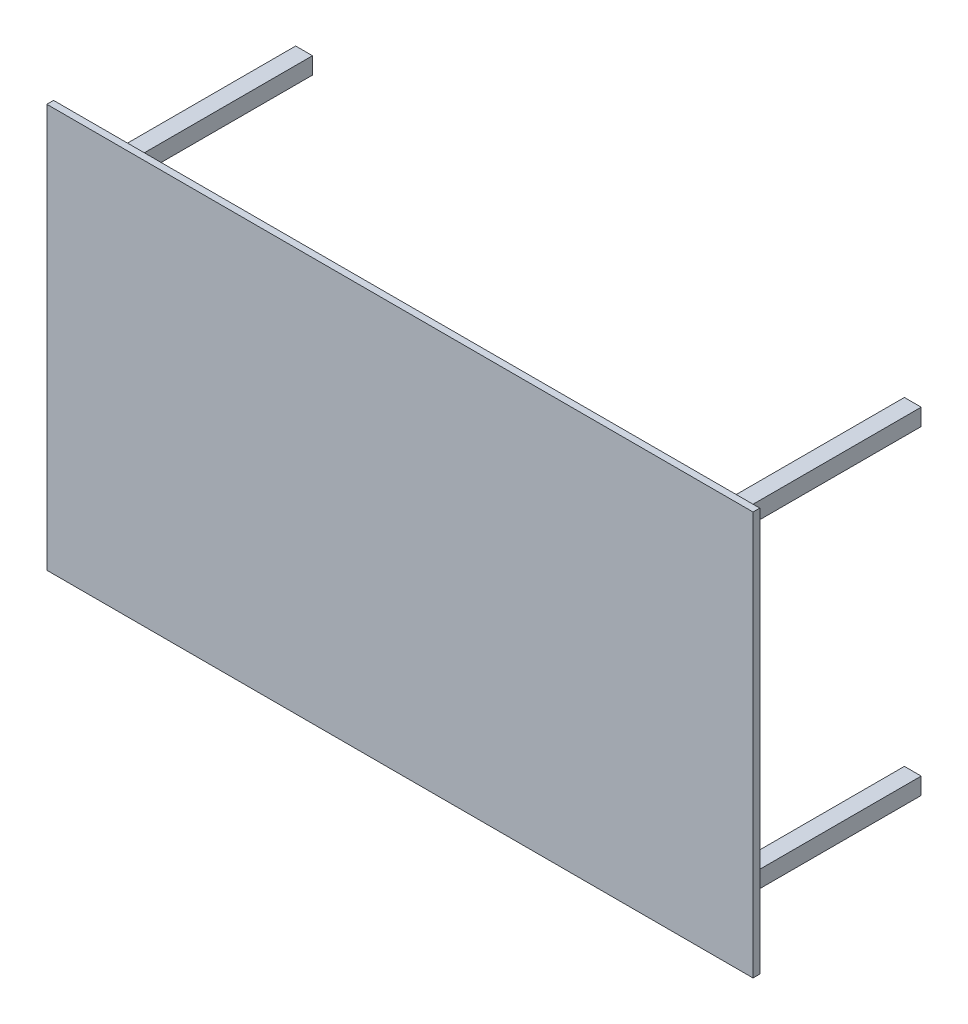
ISO-10303-21;
HEADER;
FILE_DESCRIPTION(('STEP AP214'),'2;1');
FILE_NAME('part.step','',(''),(''),'','','');
FILE_SCHEMA(('AUTOMOTIVE_DESIGN { 1 0 10303 214 1 1 1 1 }'));
ENDSEC;
DATA;
#1=APPLICATION_CONTEXT('core data for automotive mechanical design processes');
#2=APPLICATION_PROTOCOL_DEFINITION('international standard','automotive_design',2000,#1);
#3=PRODUCT_CONTEXT('',#1,'mechanical');
#4=PRODUCT('Part','Part','',(#3));
#5=PRODUCT_RELATED_PRODUCT_CATEGORY('part','',(#4));
#6=PRODUCT_DEFINITION_FORMATION('','',#4);
#7=PRODUCT_DEFINITION_CONTEXT('part definition',#1,'design');
#8=PRODUCT_DEFINITION('design','',#6,#7);
#9=PRODUCT_DEFINITION_SHAPE('','',#8);
#10=(LENGTH_UNIT() NAMED_UNIT(*) SI_UNIT(.MILLI.,.METRE.));
#11=(NAMED_UNIT(*) PLANE_ANGLE_UNIT() SI_UNIT($,.RADIAN.));
#12=(NAMED_UNIT(*) SI_UNIT($,.STERADIAN.) SOLID_ANGLE_UNIT());
#13=UNCERTAINTY_MEASURE_WITH_UNIT(LENGTH_MEASURE(1.E-05),#10,'distance_accuracy_value','');
#14=(GEOMETRIC_REPRESENTATION_CONTEXT(3) GLOBAL_UNCERTAINTY_ASSIGNED_CONTEXT((#13)) GLOBAL_UNIT_ASSIGNED_CONTEXT((#10,
#11,#12)) REPRESENTATION_CONTEXT('',''));
#15=CARTESIAN_POINT('',(0.,0.,0.));
#16=DIRECTION('',(0.,0.,1.));
#17=DIRECTION('',(1.,0.,0.));
#18=AXIS2_PLACEMENT_3D('',#15,#16,#17);
#19=CARTESIAN_POINT('',(0.,0.,0.));
#20=DIRECTION('',(0.,0.,1.));
#21=DIRECTION('',(1.,0.,0.));
#22=AXIS2_PLACEMENT_3D('',#19,#20,#21);
#23=PLANE('',#22);
#24=DIRECTION('',(0.,1.,0.));
#25=VECTOR('',#24,1.);
#26=CARTESIAN_POINT('',(880.,-450.,0.));
#27=LINE('',#26,#25);
#28=CARTESIAN_POINT('',(880.,-500.,0.));
#29=VERTEX_POINT('',#28);
#30=CARTESIAN_POINT('',(880.,-450.,0.));
#31=VERTEX_POINT('',#30);
#32=EDGE_CURVE('E193',#29,#31,#27,.T.);
#33=ORIENTED_EDGE('',*,*,#32,.F.);
#34=DIRECTION('',(-1.,0.,0.));
#35=VECTOR('',#34,1.);
#36=CARTESIAN_POINT('',(930.,-500.,0.));
#37=LINE('',#36,#35);
#38=CARTESIAN_POINT('',(930.,-500.,0.));
#39=VERTEX_POINT('',#38);
#40=EDGE_CURVE('E206',#39,#29,#37,.T.);
#41=ORIENTED_EDGE('',*,*,#40,.F.);
#42=DIRECTION('',(0.,-1.,0.));
#43=VECTOR('',#42,1.);
#44=CARTESIAN_POINT('',(930.,-450.,0.));
#45=LINE('',#44,#43);
#46=CARTESIAN_POINT('',(930.,-450.,0.));
#47=VERTEX_POINT('',#46);
#48=EDGE_CURVE('E215',#47,#39,#45,.T.);
#49=ORIENTED_EDGE('',*,*,#48,.F.);
#50=DIRECTION('',(1.,0.,0.));
#51=VECTOR('',#50,1.);
#52=CARTESIAN_POINT('',(930.,-450.,0.));
#53=LINE('',#52,#51);
#54=EDGE_CURVE('E196',#31,#47,#53,.T.);
#55=ORIENTED_EDGE('',*,*,#54,.F.);
#56=EDGE_LOOP('',(#33,#41,#49,#55));
#57=FACE_BOUND('',#56,.T.);
#58=DIRECTION('',(0.,1.,0.));
#59=VECTOR('',#58,1.);
#60=CARTESIAN_POINT('',(880.,500.,0.));
#61=LINE('',#60,#59);
#62=CARTESIAN_POINT('',(880.,450.,0.));
#63=VERTEX_POINT('',#62);
#64=CARTESIAN_POINT('',(880.,500.,0.));
#65=VERTEX_POINT('',#64);
#66=EDGE_CURVE('E264',#63,#65,#61,.T.);
#67=ORIENTED_EDGE('',*,*,#66,.F.);
#68=DIRECTION('',(-1.,0.,0.));
#69=VECTOR('',#68,1.);
#70=CARTESIAN_POINT('',(930.,450.,0.));
#71=LINE('',#70,#69);
#72=CARTESIAN_POINT('',(930.,450.,0.));
#73=VERTEX_POINT('',#72);
#74=EDGE_CURVE('E269',#73,#63,#71,.T.);
#75=ORIENTED_EDGE('',*,*,#74,.F.);
#76=DIRECTION('',(0.,-1.,0.));
#77=VECTOR('',#76,1.);
#78=CARTESIAN_POINT('',(930.,500.,0.));
#79=LINE('',#78,#77);
#80=CARTESIAN_POINT('',(930.,500.,0.));
#81=VERTEX_POINT('',#80);
#82=EDGE_CURVE('E281',#81,#73,#79,.T.);
#83=ORIENTED_EDGE('',*,*,#82,.F.);
#84=DIRECTION('',(1.,0.,0.));
#85=VECTOR('',#84,1.);
#86=CARTESIAN_POINT('',(930.,500.,0.));
#87=LINE('',#86,#85);
#88=EDGE_CURVE('E278',#65,#81,#87,.T.);
#89=ORIENTED_EDGE('',*,*,#88,.F.);
#90=EDGE_LOOP('',(#67,#75,#83,#89));
#91=FACE_BOUND('',#90,.T.);
#92=DIRECTION('',(0.,1.,0.));
#93=VECTOR('',#92,1.);
#94=CARTESIAN_POINT('',(1050.,600.,0.));
#95=LINE('',#94,#93);
#96=CARTESIAN_POINT('',(1050.,-600.,0.));
#97=VERTEX_POINT('',#96);
#98=CARTESIAN_POINT('',(1050.,600.,0.));
#99=VERTEX_POINT('',#98);
#100=EDGE_CURVE('E297',#97,#99,#95,.T.);
#101=ORIENTED_EDGE('',*,*,#100,.F.);
#102=DIRECTION('',(1.,0.,0.));
#103=VECTOR('',#102,1.);
#104=CARTESIAN_POINT('',(-1050.,-600.,0.));
#105=LINE('',#104,#103);
#106=CARTESIAN_POINT('',(-1050.,-600.,0.));
#107=VERTEX_POINT('',#106);
#108=EDGE_CURVE('E302',#107,#97,#105,.T.);
#109=ORIENTED_EDGE('',*,*,#108,.F.);
#110=DIRECTION('',(0.,-1.,0.));
#111=VECTOR('',#110,1.);
#112=CARTESIAN_POINT('',(-1050.,600.,0.));
#113=LINE('',#112,#111);
#114=CARTESIAN_POINT('',(-1050.,600.,0.));
#115=VERTEX_POINT('',#114);
#116=EDGE_CURVE('E313',#115,#107,#113,.T.);
#117=ORIENTED_EDGE('',*,*,#116,.F.);
#118=DIRECTION('',(-1.,0.,0.));
#119=VECTOR('',#118,1.);
#120=CARTESIAN_POINT('',(-1050.,600.,0.));
#121=LINE('',#120,#119);
#122=EDGE_CURVE('E311',#99,#115,#121,.T.);
#123=ORIENTED_EDGE('',*,*,#122,.F.);
#124=EDGE_LOOP('',(#101,#109,#117,#123));
#125=FACE_BOUND('',#124,.T.);
#126=DIRECTION('',(0.,1.,0.));
#127=VECTOR('',#126,1.);
#128=CARTESIAN_POINT('',(-930.,-450.,0.));
#129=LINE('',#128,#127);
#130=CARTESIAN_POINT('',(-930.,-500.,0.));
#131=VERTEX_POINT('',#130);
#132=CARTESIAN_POINT('',(-930.,-450.,0.));
#133=VERTEX_POINT('',#132);
#134=EDGE_CURVE('E231',#131,#133,#129,.T.);
#135=ORIENTED_EDGE('',*,*,#134,.F.);
#136=DIRECTION('',(-1.,0.,0.));
#137=VECTOR('',#136,1.);
#138=CARTESIAN_POINT('',(-930.,-500.,0.));
#139=LINE('',#138,#137);
#140=CARTESIAN_POINT('',(-880.,-500.,0.));
#141=VERTEX_POINT('',#140);
#142=EDGE_CURVE('E236',#141,#131,#139,.T.);
#143=ORIENTED_EDGE('',*,*,#142,.F.);
#144=DIRECTION('',(0.,-1.,0.));
#145=VECTOR('',#144,1.);
#146=CARTESIAN_POINT('',(-880.,-450.,0.));
#147=LINE('',#146,#145);
#148=CARTESIAN_POINT('',(-880.,-450.,0.));
#149=VERTEX_POINT('',#148);
#150=EDGE_CURVE('E248',#149,#141,#147,.T.);
#151=ORIENTED_EDGE('',*,*,#150,.F.);
#152=DIRECTION('',(1.,0.,0.));
#153=VECTOR('',#152,1.);
#154=CARTESIAN_POINT('',(-930.,-450.,0.));
#155=LINE('',#154,#153);
#156=EDGE_CURVE('E245',#133,#149,#155,.T.);
#157=ORIENTED_EDGE('',*,*,#156,.F.);
#158=EDGE_LOOP('',(#135,#143,#151,#157));
#159=FACE_BOUND('',#158,.T.);
#160=DIRECTION('',(0.,1.,0.));
#161=VECTOR('',#160,1.);
#162=CARTESIAN_POINT('',(-930.,500.,0.));
#163=LINE('',#162,#161);
#164=CARTESIAN_POINT('',(-930.,450.,0.));
#165=VERTEX_POINT('',#164);
#166=CARTESIAN_POINT('',(-930.,500.,0.));
#167=VERTEX_POINT('',#166);
#168=EDGE_CURVE('E192',#165,#167,#163,.T.);
#169=ORIENTED_EDGE('',*,*,#168,.F.);
#170=DIRECTION('',(-1.,0.,0.));
#171=VECTOR('',#170,1.);
#172=CARTESIAN_POINT('',(-930.,450.,0.));
#173=LINE('',#172,#171);
#174=CARTESIAN_POINT('',(-880.,450.,0.));
#175=VERTEX_POINT('',#174);
#176=EDGE_CURVE('E189',#175,#165,#173,.T.);
#177=ORIENTED_EDGE('',*,*,#176,.F.);
#178=DIRECTION('',(0.,-1.,0.));
#179=VECTOR('',#178,1.);
#180=CARTESIAN_POINT('',(-880.,500.,0.));
#181=LINE('',#180,#179);
#182=CARTESIAN_POINT('',(-880.,500.,0.));
#183=VERTEX_POINT('',#182);
#184=EDGE_CURVE('E55',#183,#175,#181,.T.);
#185=ORIENTED_EDGE('',*,*,#184,.F.);
#186=DIRECTION('',(1.,0.,0.));
#187=VECTOR('',#186,1.);
#188=CARTESIAN_POINT('',(-930.,500.,0.));
#189=LINE('',#188,#187);
#190=EDGE_CURVE('E50',#167,#183,#189,.T.);
#191=ORIENTED_EDGE('',*,*,#190,.F.);
#192=EDGE_LOOP('',(#169,#177,#185,#191));
#193=FACE_BOUND('',#192,.T.);
#194=ADVANCED_FACE('F35',(#57,#91,#125,#159,#193),#23,.F.);
#195=CARTESIAN_POINT('',(1050.,600.,20.));
#196=DIRECTION('',(-1.,0.,0.));
#197=DIRECTION('',(0.,-1.,0.));
#198=AXIS2_PLACEMENT_3D('',#195,#196,#197);
#199=PLANE('',#198);
#200=ORIENTED_EDGE('',*,*,#100,.T.);
#201=DIRECTION('',(0.,0.,-1.));
#202=VECTOR('',#201,1.);
#203=CARTESIAN_POINT('',(1050.,600.,20.));
#204=LINE('',#203,#202);
#205=CARTESIAN_POINT('',(1050.,600.,20.));
#206=VERTEX_POINT('',#205);
#207=EDGE_CURVE('E11',#206,#99,#204,.T.);
#208=ORIENTED_EDGE('',*,*,#207,.F.);
#209=DIRECTION('',(0.,1.,0.));
#210=VECTOR('',#209,1.);
#211=CARTESIAN_POINT('',(1050.,600.,20.));
#212=LINE('',#211,#210);
#213=CARTESIAN_POINT('',(1050.,-600.,20.));
#214=VERTEX_POINT('',#213);
#215=EDGE_CURVE('E298',#214,#206,#212,.T.);
#216=ORIENTED_EDGE('',*,*,#215,.F.);
#217=DIRECTION('',(0.,0.,-1.));
#218=VECTOR('',#217,1.);
#219=CARTESIAN_POINT('',(1050.,-600.,20.));
#220=LINE('',#219,#218);
#221=EDGE_CURVE('E308',#214,#97,#220,.T.);
#222=ORIENTED_EDGE('',*,*,#221,.T.);
#223=EDGE_LOOP('',(#200,#208,#216,#222));
#224=FACE_BOUND('',#223,.T.);
#225=ADVANCED_FACE('F37',(#224),#199,.F.);
#226=CARTESIAN_POINT('',(-1050.,600.,20.));
#227=DIRECTION('',(0.,-1.,0.));
#228=DIRECTION('',(0.,0.,-1.));
#229=AXIS2_PLACEMENT_3D('',#226,#227,#228);
#230=PLANE('',#229);
#231=ORIENTED_EDGE('',*,*,#122,.T.);
#232=DIRECTION('',(0.,0.,-1.));
#233=VECTOR('',#232,1.);
#234=CARTESIAN_POINT('',(-1050.,600.,20.));
#235=LINE('',#234,#233);
#236=CARTESIAN_POINT('',(-1050.,600.,20.));
#237=VERTEX_POINT('',#236);
#238=EDGE_CURVE('E43',#237,#115,#235,.T.);
#239=ORIENTED_EDGE('',*,*,#238,.F.);
#240=DIRECTION('',(-1.,0.,0.));
#241=VECTOR('',#240,1.);
#242=CARTESIAN_POINT('',(-1050.,600.,20.));
#243=LINE('',#242,#241);
#244=EDGE_CURVE('E301',#206,#237,#243,.T.);
#245=ORIENTED_EDGE('',*,*,#244,.F.);
#246=ORIENTED_EDGE('',*,*,#207,.T.);
#247=EDGE_LOOP('',(#231,#239,#245,#246));
#248=FACE_BOUND('',#247,.T.);
#249=ADVANCED_FACE('F341',(#248),#230,.F.);
#250=CARTESIAN_POINT('',(-1050.,600.,20.));
#251=DIRECTION('',(1.,0.,0.));
#252=DIRECTION('',(0.,0.,-1.));
#253=AXIS2_PLACEMENT_3D('',#250,#251,#252);
#254=PLANE('',#253);
#255=ORIENTED_EDGE('',*,*,#116,.T.);
#256=DIRECTION('',(0.,0.,-1.));
#257=VECTOR('',#256,1.);
#258=CARTESIAN_POINT('',(-1050.,-600.,20.));
#259=LINE('',#258,#257);
#260=CARTESIAN_POINT('',(-1050.,-600.,20.));
#261=VERTEX_POINT('',#260);
#262=EDGE_CURVE('E318',#261,#107,#259,.T.);
#263=ORIENTED_EDGE('',*,*,#262,.F.);
#264=DIRECTION('',(0.,-1.,0.));
#265=VECTOR('',#264,1.);
#266=CARTESIAN_POINT('',(-1050.,600.,20.));
#267=LINE('',#266,#265);
#268=EDGE_CURVE('E304',#237,#261,#267,.T.);
#269=ORIENTED_EDGE('',*,*,#268,.F.);
#270=ORIENTED_EDGE('',*,*,#238,.T.);
#271=EDGE_LOOP('',(#255,#263,#269,#270));
#272=FACE_BOUND('',#271,.T.);
#273=ADVANCED_FACE('F325',(#272),#254,.F.);
#274=CARTESIAN_POINT('',(-1050.,-600.,20.));
#275=DIRECTION('',(0.,1.,0.));
#276=DIRECTION('',(0.,0.,1.));
#277=AXIS2_PLACEMENT_3D('',#274,#275,#276);
#278=PLANE('',#277);
#279=ORIENTED_EDGE('',*,*,#108,.T.);
#280=ORIENTED_EDGE('',*,*,#221,.F.);
#281=DIRECTION('',(1.,0.,0.));
#282=VECTOR('',#281,1.);
#283=CARTESIAN_POINT('',(-1050.,-600.,20.));
#284=LINE('',#283,#282);
#285=EDGE_CURVE('E306',#261,#214,#284,.T.);
#286=ORIENTED_EDGE('',*,*,#285,.F.);
#287=ORIENTED_EDGE('',*,*,#262,.T.);
#288=EDGE_LOOP('',(#279,#280,#286,#287));
#289=FACE_BOUND('',#288,.T.);
#290=ADVANCED_FACE('F334',(#289),#278,.F.);
#291=CARTESIAN_POINT('',(0.,0.,20.));
#292=DIRECTION('',(0.,0.,1.));
#293=DIRECTION('',(1.,0.,0.));
#294=AXIS2_PLACEMENT_3D('',#291,#292,#293);
#295=PLANE('',#294);
#296=ORIENTED_EDGE('',*,*,#215,.T.);
#297=ORIENTED_EDGE('',*,*,#244,.T.);
#298=ORIENTED_EDGE('',*,*,#268,.T.);
#299=ORIENTED_EDGE('',*,*,#285,.T.);
#300=EDGE_LOOP('',(#296,#297,#298,#299));
#301=FACE_BOUND('',#300,.T.);
#302=ADVANCED_FACE('F340',(#301),#295,.T.);
#303=CARTESIAN_POINT('',(880.,500.,-600.));
#304=DIRECTION('',(1.,0.,0.));
#305=DIRECTION('',(0.,0.,-1.));
#306=AXIS2_PLACEMENT_3D('',#303,#304,#305);
#307=PLANE('',#306);
#308=ORIENTED_EDGE('',*,*,#66,.T.);
#309=DIRECTION('',(0.,0.,1.));
#310=VECTOR('',#309,1.);
#311=CARTESIAN_POINT('',(880.,500.,-600.));
#312=LINE('',#311,#310);
#313=CARTESIAN_POINT('',(880.,500.,-600.));
#314=VERTEX_POINT('',#313);
#315=EDGE_CURVE('E294',#314,#65,#312,.T.);
#316=ORIENTED_EDGE('',*,*,#315,.F.);
#317=DIRECTION('',(0.,1.,0.));
#318=VECTOR('',#317,1.);
#319=CARTESIAN_POINT('',(880.,500.,-600.));
#320=LINE('',#319,#318);
#321=CARTESIAN_POINT('',(880.,450.,-600.));
#322=VERTEX_POINT('',#321);
#323=EDGE_CURVE('E265',#322,#314,#320,.T.);
#324=ORIENTED_EDGE('',*,*,#323,.F.);
#325=DIRECTION('',(0.,0.,1.));
#326=VECTOR('',#325,1.);
#327=CARTESIAN_POINT('',(880.,450.,-600.));
#328=LINE('',#327,#326);
#329=EDGE_CURVE('E275',#322,#63,#328,.T.);
#330=ORIENTED_EDGE('',*,*,#329,.T.);
#331=EDGE_LOOP('',(#308,#316,#324,#330));
#332=FACE_BOUND('',#331,.T.);
#333=ADVANCED_FACE('F361',(#332),#307,.F.);
#334=CARTESIAN_POINT('',(930.,500.,-600.));
#335=DIRECTION('',(0.,-1.,0.));
#336=DIRECTION('',(0.,0.,-1.));
#337=AXIS2_PLACEMENT_3D('',#334,#335,#336);
#338=PLANE('',#337);
#339=ORIENTED_EDGE('',*,*,#88,.T.);
#340=DIRECTION('',(0.,0.,1.));
#341=VECTOR('',#340,1.);
#342=CARTESIAN_POINT('',(930.,500.,-600.));
#343=LINE('',#342,#341);
#344=CARTESIAN_POINT('',(930.,500.,-600.));
#345=VERTEX_POINT('',#344);
#346=EDGE_CURVE('E291',#345,#81,#343,.T.);
#347=ORIENTED_EDGE('',*,*,#346,.F.);
#348=DIRECTION('',(1.,0.,0.));
#349=VECTOR('',#348,1.);
#350=CARTESIAN_POINT('',(930.,500.,-600.));
#351=LINE('',#350,#349);
#352=EDGE_CURVE('E268',#314,#345,#351,.T.);
#353=ORIENTED_EDGE('',*,*,#352,.F.);
#354=ORIENTED_EDGE('',*,*,#315,.T.);
#355=EDGE_LOOP('',(#339,#347,#353,#354));
#356=FACE_BOUND('',#355,.T.);
#357=ADVANCED_FACE('F365',(#356),#338,.F.);
#358=CARTESIAN_POINT('',(930.,500.,-600.));
#359=DIRECTION('',(-1.,0.,0.));
#360=DIRECTION('',(0.,0.,1.));
#361=AXIS2_PLACEMENT_3D('',#358,#359,#360);
#362=PLANE('',#361);
#363=ORIENTED_EDGE('',*,*,#82,.T.);
#364=DIRECTION('',(0.,0.,1.));
#365=VECTOR('',#364,1.);
#366=CARTESIAN_POINT('',(930.,450.,-600.));
#367=LINE('',#366,#365);
#368=CARTESIAN_POINT('',(930.,450.,-600.));
#369=VERTEX_POINT('',#368);
#370=EDGE_CURVE('E288',#369,#73,#367,.T.);
#371=ORIENTED_EDGE('',*,*,#370,.F.);
#372=DIRECTION('',(0.,-1.,0.));
#373=VECTOR('',#372,1.);
#374=CARTESIAN_POINT('',(930.,500.,-600.));
#375=LINE('',#374,#373);
#376=EDGE_CURVE('E271',#345,#369,#375,.T.);
#377=ORIENTED_EDGE('',*,*,#376,.F.);
#378=ORIENTED_EDGE('',*,*,#346,.T.);
#379=EDGE_LOOP('',(#363,#371,#377,#378));
#380=FACE_BOUND('',#379,.T.);
#381=ADVANCED_FACE('F370',(#380),#362,.F.);
#382=CARTESIAN_POINT('',(930.,450.,-600.));
#383=DIRECTION('',(0.,1.,0.));
#384=DIRECTION('',(0.,0.,1.));
#385=AXIS2_PLACEMENT_3D('',#382,#383,#384);
#386=PLANE('',#385);
#387=ORIENTED_EDGE('',*,*,#74,.T.);
#388=ORIENTED_EDGE('',*,*,#329,.F.);
#389=DIRECTION('',(-1.,0.,0.));
#390=VECTOR('',#389,1.);
#391=CARTESIAN_POINT('',(930.,450.,-600.));
#392=LINE('',#391,#390);
#393=EDGE_CURVE('E273',#369,#322,#392,.T.);
#394=ORIENTED_EDGE('',*,*,#393,.F.);
#395=ORIENTED_EDGE('',*,*,#370,.T.);
#396=EDGE_LOOP('',(#387,#388,#394,#395));
#397=FACE_BOUND('',#396,.T.);
#398=ADVANCED_FACE('F376',(#397),#386,.F.);
#399=CARTESIAN_POINT('',(0.,0.,-600.));
#400=DIRECTION('',(0.,0.,-1.));
#401=DIRECTION('',(-1.,0.,0.));
#402=AXIS2_PLACEMENT_3D('',#399,#400,#401);
#403=PLANE('',#402);
#404=ORIENTED_EDGE('',*,*,#323,.T.);
#405=ORIENTED_EDGE('',*,*,#352,.T.);
#406=ORIENTED_EDGE('',*,*,#376,.T.);
#407=ORIENTED_EDGE('',*,*,#393,.T.);
#408=EDGE_LOOP('',(#404,#405,#406,#407));
#409=FACE_BOUND('',#408,.T.);
#410=ADVANCED_FACE('F380',(#409),#403,.T.);
#411=CARTESIAN_POINT('',(-930.,-450.,-600.));
#412=DIRECTION('',(1.,0.,0.));
#413=DIRECTION('',(0.,0.,-1.));
#414=AXIS2_PLACEMENT_3D('',#411,#412,#413);
#415=PLANE('',#414);
#416=ORIENTED_EDGE('',*,*,#134,.T.);
#417=DIRECTION('',(0.,0.,1.));
#418=VECTOR('',#417,1.);
#419=CARTESIAN_POINT('',(-930.,-450.,-600.));
#420=LINE('',#419,#418);
#421=CARTESIAN_POINT('',(-930.,-450.,-600.));
#422=VERTEX_POINT('',#421);
#423=EDGE_CURVE('E261',#422,#133,#420,.T.);
#424=ORIENTED_EDGE('',*,*,#423,.F.);
#425=DIRECTION('',(0.,1.,0.));
#426=VECTOR('',#425,1.);
#427=CARTESIAN_POINT('',(-930.,-450.,-600.));
#428=LINE('',#427,#426);
#429=CARTESIAN_POINT('',(-930.,-500.,-600.));
#430=VERTEX_POINT('',#429);
#431=EDGE_CURVE('E232',#430,#422,#428,.T.);
#432=ORIENTED_EDGE('',*,*,#431,.F.);
#433=DIRECTION('',(0.,0.,1.));
#434=VECTOR('',#433,1.);
#435=CARTESIAN_POINT('',(-930.,-500.,-600.));
#436=LINE('',#435,#434);
#437=EDGE_CURVE('E242',#430,#131,#436,.T.);
#438=ORIENTED_EDGE('',*,*,#437,.T.);
#439=EDGE_LOOP('',(#416,#424,#432,#438));
#440=FACE_BOUND('',#439,.T.);
#441=ADVANCED_FACE('F384',(#440),#415,.F.);
#442=CARTESIAN_POINT('',(-930.,-450.,-600.));
#443=DIRECTION('',(0.,-1.,0.));
#444=DIRECTION('',(0.,0.,-1.));
#445=AXIS2_PLACEMENT_3D('',#442,#443,#444);
#446=PLANE('',#445);
#447=ORIENTED_EDGE('',*,*,#156,.T.);
#448=DIRECTION('',(0.,0.,1.));
#449=VECTOR('',#448,1.);
#450=CARTESIAN_POINT('',(-880.,-450.,-600.));
#451=LINE('',#450,#449);
#452=CARTESIAN_POINT('',(-880.,-450.,-600.));
#453=VERTEX_POINT('',#452);
#454=EDGE_CURVE('E258',#453,#149,#451,.T.);
#455=ORIENTED_EDGE('',*,*,#454,.F.);
#456=DIRECTION('',(1.,0.,0.));
#457=VECTOR('',#456,1.);
#458=CARTESIAN_POINT('',(-930.,-450.,-600.));
#459=LINE('',#458,#457);
#460=EDGE_CURVE('E235',#422,#453,#459,.T.);
#461=ORIENTED_EDGE('',*,*,#460,.F.);
#462=ORIENTED_EDGE('',*,*,#423,.T.);
#463=EDGE_LOOP('',(#447,#455,#461,#462));
#464=FACE_BOUND('',#463,.T.);
#465=ADVANCED_FACE('F388',(#464),#446,.F.);
#466=CARTESIAN_POINT('',(-880.,-450.,-600.));
#467=DIRECTION('',(-1.,0.,0.));
#468=DIRECTION('',(0.,0.,1.));
#469=AXIS2_PLACEMENT_3D('',#466,#467,#468);
#470=PLANE('',#469);
#471=ORIENTED_EDGE('',*,*,#150,.T.);
#472=DIRECTION('',(0.,0.,1.));
#473=VECTOR('',#472,1.);
#474=CARTESIAN_POINT('',(-880.,-500.,-600.));
#475=LINE('',#474,#473);
#476=CARTESIAN_POINT('',(-880.,-500.,-600.));
#477=VERTEX_POINT('',#476);
#478=EDGE_CURVE('E255',#477,#141,#475,.T.);
#479=ORIENTED_EDGE('',*,*,#478,.F.);
#480=DIRECTION('',(0.,-1.,0.));
#481=VECTOR('',#480,1.);
#482=CARTESIAN_POINT('',(-880.,-450.,-600.));
#483=LINE('',#482,#481);
#484=EDGE_CURVE('E238',#453,#477,#483,.T.);
#485=ORIENTED_EDGE('',*,*,#484,.F.);
#486=ORIENTED_EDGE('',*,*,#454,.T.);
#487=EDGE_LOOP('',(#471,#479,#485,#486));
#488=FACE_BOUND('',#487,.T.);
#489=ADVANCED_FACE('F392',(#488),#470,.F.);
#490=CARTESIAN_POINT('',(-930.,-500.,-600.));
#491=DIRECTION('',(0.,1.,0.));
#492=DIRECTION('',(0.,0.,1.));
#493=AXIS2_PLACEMENT_3D('',#490,#491,#492);
#494=PLANE('',#493);
#495=ORIENTED_EDGE('',*,*,#142,.T.);
#496=ORIENTED_EDGE('',*,*,#437,.F.);
#497=DIRECTION('',(-1.,0.,0.));
#498=VECTOR('',#497,1.);
#499=CARTESIAN_POINT('',(-930.,-500.,-600.));
#500=LINE('',#499,#498);
#501=EDGE_CURVE('E240',#477,#430,#500,.T.);
#502=ORIENTED_EDGE('',*,*,#501,.F.);
#503=ORIENTED_EDGE('',*,*,#478,.T.);
#504=EDGE_LOOP('',(#495,#496,#502,#503));
#505=FACE_BOUND('',#504,.T.);
#506=ADVANCED_FACE('F396',(#505),#494,.F.);
#507=CARTESIAN_POINT('',(0.,0.,-600.));
#508=DIRECTION('',(0.,0.,1.));
#509=DIRECTION('',(1.,0.,0.));
#510=AXIS2_PLACEMENT_3D('',#507,#508,#509);
#511=PLANE('',#510);
#512=ORIENTED_EDGE('',*,*,#431,.T.);
#513=ORIENTED_EDGE('',*,*,#460,.T.);
#514=ORIENTED_EDGE('',*,*,#484,.T.);
#515=ORIENTED_EDGE('',*,*,#501,.T.);
#516=EDGE_LOOP('',(#512,#513,#514,#515));
#517=FACE_BOUND('',#516,.T.);
#518=ADVANCED_FACE('F400',(#517),#511,.F.);
#519=CARTESIAN_POINT('',(880.,-450.,-600.));
#520=DIRECTION('',(1.,0.,0.));
#521=DIRECTION('',(0.,0.,-1.));
#522=AXIS2_PLACEMENT_3D('',#519,#520,#521);
#523=PLANE('',#522);
#524=ORIENTED_EDGE('',*,*,#32,.T.);
#525=DIRECTION('',(0.,0.,1.));
#526=VECTOR('',#525,1.);
#527=CARTESIAN_POINT('',(880.,-450.,-600.));
#528=LINE('',#527,#526);
#529=CARTESIAN_POINT('',(880.,-450.,-600.));
#530=VERTEX_POINT('',#529);
#531=EDGE_CURVE('E228',#530,#31,#528,.T.);
#532=ORIENTED_EDGE('',*,*,#531,.F.);
#533=DIRECTION('',(0.,1.,0.));
#534=VECTOR('',#533,1.);
#535=CARTESIAN_POINT('',(880.,-450.,-600.));
#536=LINE('',#535,#534);
#537=CARTESIAN_POINT('',(880.,-500.,-600.));
#538=VERTEX_POINT('',#537);
#539=EDGE_CURVE('E202',#538,#530,#536,.T.);
#540=ORIENTED_EDGE('',*,*,#539,.F.);
#541=DIRECTION('',(0.,0.,1.));
#542=VECTOR('',#541,1.);
#543=CARTESIAN_POINT('',(880.,-500.,-600.));
#544=LINE('',#543,#542);
#545=EDGE_CURVE('E211',#538,#29,#544,.T.);
#546=ORIENTED_EDGE('',*,*,#545,.T.);
#547=EDGE_LOOP('',(#524,#532,#540,#546));
#548=FACE_BOUND('',#547,.T.);
#549=ADVANCED_FACE('F404',(#548),#523,.F.);
#550=CARTESIAN_POINT('',(930.,-450.,-600.));
#551=DIRECTION('',(0.,-1.,0.));
#552=DIRECTION('',(0.,0.,-1.));
#553=AXIS2_PLACEMENT_3D('',#550,#551,#552);
#554=PLANE('',#553);
#555=ORIENTED_EDGE('',*,*,#54,.T.);
#556=DIRECTION('',(0.,0.,1.));
#557=VECTOR('',#556,1.);
#558=CARTESIAN_POINT('',(930.,-450.,-600.));
#559=LINE('',#558,#557);
#560=CARTESIAN_POINT('',(930.,-450.,-600.));
#561=VERTEX_POINT('',#560);
#562=EDGE_CURVE('E225',#561,#47,#559,.T.);
#563=ORIENTED_EDGE('',*,*,#562,.F.);
#564=DIRECTION('',(1.,0.,0.));
#565=VECTOR('',#564,1.);
#566=CARTESIAN_POINT('',(930.,-450.,-600.));
#567=LINE('',#566,#565);
#568=EDGE_CURVE('E205',#530,#561,#567,.T.);
#569=ORIENTED_EDGE('',*,*,#568,.F.);
#570=ORIENTED_EDGE('',*,*,#531,.T.);
#571=EDGE_LOOP('',(#555,#563,#569,#570));
#572=FACE_BOUND('',#571,.T.);
#573=ADVANCED_FACE('F408',(#572),#554,.F.);
#574=CARTESIAN_POINT('',(930.,-450.,-600.));
#575=DIRECTION('',(-1.,0.,0.));
#576=DIRECTION('',(0.,0.,1.));
#577=AXIS2_PLACEMENT_3D('',#574,#575,#576);
#578=PLANE('',#577);
#579=ORIENTED_EDGE('',*,*,#48,.T.);
#580=DIRECTION('',(0.,0.,1.));
#581=VECTOR('',#580,1.);
#582=CARTESIAN_POINT('',(930.,-500.,-600.));
#583=LINE('',#582,#581);
#584=CARTESIAN_POINT('',(930.,-500.,-600.));
#585=VERTEX_POINT('',#584);
#586=EDGE_CURVE('E222',#585,#39,#583,.T.);
#587=ORIENTED_EDGE('',*,*,#586,.F.);
#588=DIRECTION('',(0.,-1.,0.));
#589=VECTOR('',#588,1.);
#590=CARTESIAN_POINT('',(930.,-450.,-600.));
#591=LINE('',#590,#589);
#592=EDGE_CURVE('E208',#561,#585,#591,.T.);
#593=ORIENTED_EDGE('',*,*,#592,.F.);
#594=ORIENTED_EDGE('',*,*,#562,.T.);
#595=EDGE_LOOP('',(#579,#587,#593,#594));
#596=FACE_BOUND('',#595,.T.);
#597=ADVANCED_FACE('F412',(#596),#578,.F.);
#598=CARTESIAN_POINT('',(930.,-500.,-600.));
#599=DIRECTION('',(0.,1.,0.));
#600=DIRECTION('',(0.,0.,1.));
#601=AXIS2_PLACEMENT_3D('',#598,#599,#600);
#602=PLANE('',#601);
#603=ORIENTED_EDGE('',*,*,#40,.T.);
#604=ORIENTED_EDGE('',*,*,#545,.F.);
#605=DIRECTION('',(-1.,0.,0.));
#606=VECTOR('',#605,1.);
#607=CARTESIAN_POINT('',(930.,-500.,-600.));
#608=LINE('',#607,#606);
#609=EDGE_CURVE('E210',#585,#538,#608,.T.);
#610=ORIENTED_EDGE('',*,*,#609,.F.);
#611=ORIENTED_EDGE('',*,*,#586,.T.);
#612=EDGE_LOOP('',(#603,#604,#610,#611));
#613=FACE_BOUND('',#612,.T.);
#614=ADVANCED_FACE('F416',(#613),#602,.F.);
#615=CARTESIAN_POINT('',(0.,0.,-600.));
#616=DIRECTION('',(0.,0.,-1.));
#617=DIRECTION('',(-1.,0.,0.));
#618=AXIS2_PLACEMENT_3D('',#615,#616,#617);
#619=PLANE('',#618);
#620=ORIENTED_EDGE('',*,*,#539,.T.);
#621=ORIENTED_EDGE('',*,*,#568,.T.);
#622=ORIENTED_EDGE('',*,*,#592,.T.);
#623=ORIENTED_EDGE('',*,*,#609,.T.);
#624=EDGE_LOOP('',(#620,#621,#622,#623));
#625=FACE_BOUND('',#624,.T.);
#626=ADVANCED_FACE('F420',(#625),#619,.T.);
#627=CARTESIAN_POINT('',(-930.,500.,-600.));
#628=DIRECTION('',(1.,0.,0.));
#629=DIRECTION('',(0.,0.,-1.));
#630=AXIS2_PLACEMENT_3D('',#627,#628,#629);
#631=PLANE('',#630);
#632=ORIENTED_EDGE('',*,*,#168,.T.);
#633=DIRECTION('',(0.,0.,1.));
#634=VECTOR('',#633,1.);
#635=CARTESIAN_POINT('',(-930.,500.,-600.));
#636=LINE('',#635,#634);
#637=CARTESIAN_POINT('',(-930.,500.,-600.));
#638=VERTEX_POINT('',#637);
#639=EDGE_CURVE('E173',#638,#167,#636,.T.);
#640=ORIENTED_EDGE('',*,*,#639,.F.);
#641=DIRECTION('',(0.,1.,0.));
#642=VECTOR('',#641,1.);
#643=CARTESIAN_POINT('',(-930.,500.,-600.));
#644=LINE('',#643,#642);
#645=CARTESIAN_POINT('',(-930.,450.,-600.));
#646=VERTEX_POINT('',#645);
#647=EDGE_CURVE('E180',#646,#638,#644,.T.);
#648=ORIENTED_EDGE('',*,*,#647,.F.);
#649=DIRECTION('',(0.,0.,1.));
#650=VECTOR('',#649,1.);
#651=CARTESIAN_POINT('',(-930.,450.,-600.));
#652=LINE('',#651,#650);
#653=EDGE_CURVE('E586',#646,#165,#652,.T.);
#654=ORIENTED_EDGE('',*,*,#653,.T.);
#655=EDGE_LOOP('',(#632,#640,#648,#654));
#656=FACE_BOUND('',#655,.T.);
#657=ADVANCED_FACE('F191',(#656),#631,.F.);
#658=CARTESIAN_POINT('',(-930.,500.,-600.));
#659=DIRECTION('',(0.,-1.,0.));
#660=DIRECTION('',(0.,0.,-1.));
#661=AXIS2_PLACEMENT_3D('',#658,#659,#660);
#662=PLANE('',#661);
#663=ORIENTED_EDGE('',*,*,#190,.T.);
#664=DIRECTION('',(0.,0.,1.));
#665=VECTOR('',#664,1.);
#666=CARTESIAN_POINT('',(-880.,500.,-600.));
#667=LINE('',#666,#665);
#668=CARTESIAN_POINT('',(-880.,500.,-600.));
#669=VERTEX_POINT('',#668);
#670=EDGE_CURVE('E176',#669,#183,#667,.T.);
#671=ORIENTED_EDGE('',*,*,#670,.F.);
#672=DIRECTION('',(1.,0.,0.));
#673=VECTOR('',#672,1.);
#674=CARTESIAN_POINT('',(-930.,500.,-600.));
#675=LINE('',#674,#673);
#676=EDGE_CURVE('E169',#638,#669,#675,.T.);
#677=ORIENTED_EDGE('',*,*,#676,.F.);
#678=ORIENTED_EDGE('',*,*,#639,.T.);
#679=EDGE_LOOP('',(#663,#671,#677,#678));
#680=FACE_BOUND('',#679,.T.);
#681=ADVANCED_FACE('F171',(#680),#662,.F.);
#682=CARTESIAN_POINT('',(-880.,500.,-600.));
#683=DIRECTION('',(-1.,0.,0.));
#684=DIRECTION('',(0.,0.,1.));
#685=AXIS2_PLACEMENT_3D('',#682,#683,#684);
#686=PLANE('',#685);
#687=ORIENTED_EDGE('',*,*,#184,.T.);
#688=DIRECTION('',(0.,0.,1.));
#689=VECTOR('',#688,1.);
#690=CARTESIAN_POINT('',(-880.,450.,-600.));
#691=LINE('',#690,#689);
#692=CARTESIAN_POINT('',(-880.,450.,-600.));
#693=VERTEX_POINT('',#692);
#694=EDGE_CURVE('E198',#693,#175,#691,.T.);
#695=ORIENTED_EDGE('',*,*,#694,.F.);
#696=DIRECTION('',(0.,-1.,0.));
#697=VECTOR('',#696,1.);
#698=CARTESIAN_POINT('',(-880.,500.,-600.));
#699=LINE('',#698,#697);
#700=EDGE_CURVE('E179',#669,#693,#699,.T.);
#701=ORIENTED_EDGE('',*,*,#700,.F.);
#702=ORIENTED_EDGE('',*,*,#670,.T.);
#703=EDGE_LOOP('',(#687,#695,#701,#702));
#704=FACE_BOUND('',#703,.T.);
#705=ADVANCED_FACE('F429',(#704),#686,.F.);
#706=CARTESIAN_POINT('',(-930.,450.,-600.));
#707=DIRECTION('',(0.,1.,0.));
#708=DIRECTION('',(0.,0.,1.));
#709=AXIS2_PLACEMENT_3D('',#706,#707,#708);
#710=PLANE('',#709);
#711=ORIENTED_EDGE('',*,*,#176,.T.);
#712=ORIENTED_EDGE('',*,*,#653,.F.);
#713=DIRECTION('',(-1.,0.,0.));
#714=VECTOR('',#713,1.);
#715=CARTESIAN_POINT('',(-930.,450.,-600.));
#716=LINE('',#715,#714);
#717=EDGE_CURVE('E185',#693,#646,#716,.T.);
#718=ORIENTED_EDGE('',*,*,#717,.F.);
#719=ORIENTED_EDGE('',*,*,#694,.T.);
#720=EDGE_LOOP('',(#711,#712,#718,#719));
#721=FACE_BOUND('',#720,.T.);
#722=ADVANCED_FACE('F432',(#721),#710,.F.);
#723=CARTESIAN_POINT('',(0.,0.,-600.));
#724=DIRECTION('',(0.,0.,1.));
#725=DIRECTION('',(1.,0.,0.));
#726=AXIS2_PLACEMENT_3D('',#723,#724,#725);
#727=PLANE('',#726);
#728=ORIENTED_EDGE('',*,*,#647,.T.);
#729=ORIENTED_EDGE('',*,*,#676,.T.);
#730=ORIENTED_EDGE('',*,*,#700,.T.);
#731=ORIENTED_EDGE('',*,*,#717,.T.);
#732=EDGE_LOOP('',(#728,#729,#730,#731));
#733=FACE_BOUND('',#732,.T.);
#734=ADVANCED_FACE('F183',(#733),#727,.F.);
#735=CLOSED_SHELL('',(#194,#225,#249,#273,#290,#302,#333,#357,#381,#398,#410,#441,#465,#489,
#506,#518,#549,#573,#597,#614,#626,#657,#681,#705,#722,#734));
#736=MANIFOLD_SOLID_BREP('B2',#735);
#737=ADVANCED_BREP_SHAPE_REPRESENTATION('',(#18,#736),#14);
#738=SHAPE_DEFINITION_REPRESENTATION(#9,#737);
ENDSEC;
END-ISO-10303-21;
